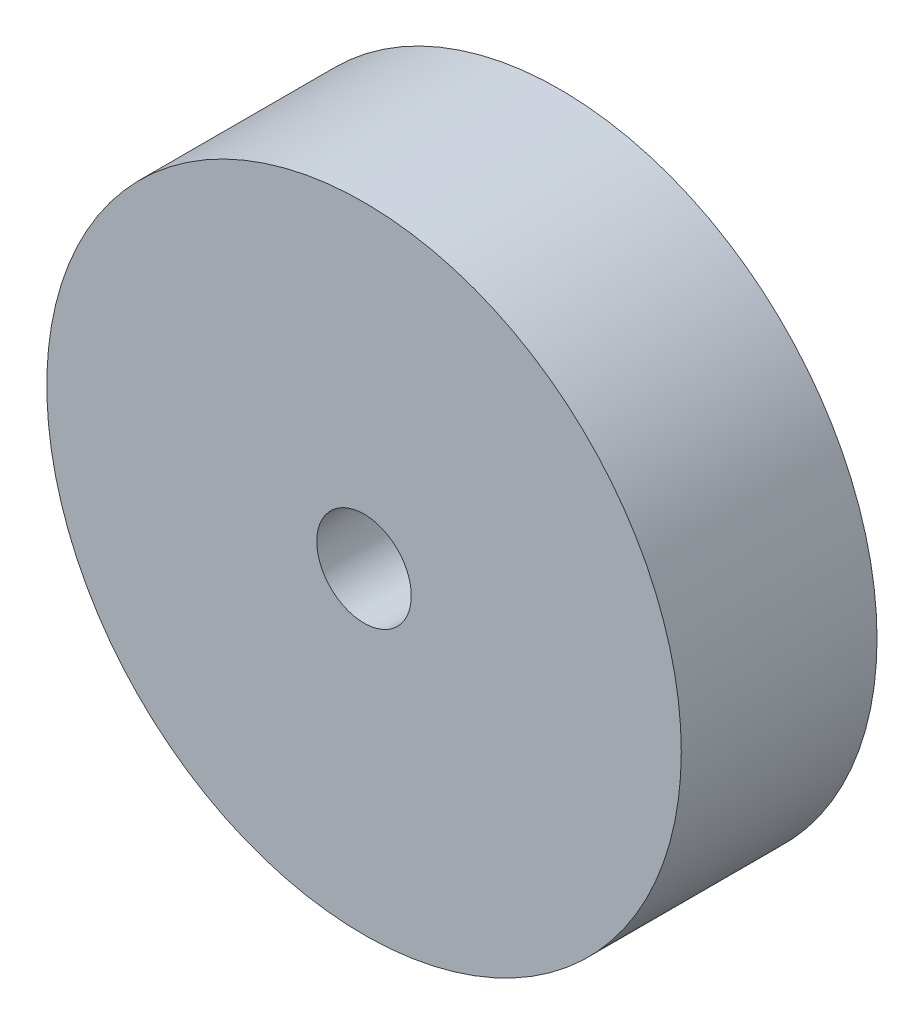
ISO-10303-21;
HEADER;
FILE_DESCRIPTION(('STEP AP214'),'2;1');
FILE_NAME('part.step','',(''),(''),'','','');
FILE_SCHEMA(('AUTOMOTIVE_DESIGN { 1 0 10303 214 1 1 1 1 }'));
ENDSEC;
DATA;
#1=APPLICATION_CONTEXT('core data for automotive mechanical design processes');
#2=APPLICATION_PROTOCOL_DEFINITION('international standard','automotive_design',2000,#1);
#3=PRODUCT_CONTEXT('',#1,'mechanical');
#4=PRODUCT('Part','Part','',(#3));
#5=PRODUCT_RELATED_PRODUCT_CATEGORY('part','',(#4));
#6=PRODUCT_DEFINITION_FORMATION('','',#4);
#7=PRODUCT_DEFINITION_CONTEXT('part definition',#1,'design');
#8=PRODUCT_DEFINITION('design','',#6,#7);
#9=PRODUCT_DEFINITION_SHAPE('','',#8);
#10=(LENGTH_UNIT() NAMED_UNIT(*) SI_UNIT(.MILLI.,.METRE.));
#11=(NAMED_UNIT(*) PLANE_ANGLE_UNIT() SI_UNIT($,.RADIAN.));
#12=(NAMED_UNIT(*) SI_UNIT($,.STERADIAN.) SOLID_ANGLE_UNIT());
#13=UNCERTAINTY_MEASURE_WITH_UNIT(LENGTH_MEASURE(1.E-05),#10,'distance_accuracy_value','');
#14=(GEOMETRIC_REPRESENTATION_CONTEXT(3) GLOBAL_UNCERTAINTY_ASSIGNED_CONTEXT((#13)) GLOBAL_UNIT_ASSIGNED_CONTEXT((#10,
#11,#12)) REPRESENTATION_CONTEXT('',''));
#15=CARTESIAN_POINT('',(0.,0.,0.));
#16=DIRECTION('',(0.,0.,1.));
#17=DIRECTION('',(1.,0.,0.));
#18=AXIS2_PLACEMENT_3D('',#15,#16,#17);
#19=CARTESIAN_POINT('',(-29.0822504710818,-1.70382614903984,5.8));
#20=DIRECTION('',(0.,0.,-1.));
#21=DIRECTION('',(-1.,0.,0.));
#22=AXIS2_PLACEMENT_3D('',#19,#20,#21);
#23=CYLINDRICAL_SURFACE('',#22,9.4);
#24=CARTESIAN_POINT('',(-29.0822504710818,-1.70382614903984,5.8));
#25=DIRECTION('',(0.,0.,1.));
#26=DIRECTION('',(1.,0.,0.));
#27=AXIS2_PLACEMENT_3D('',#24,#25,#26);
#28=CIRCLE('',#27,9.4);
#29=CARTESIAN_POINT('',(-19.6822504710818,-1.70382614903984,5.8));
#30=VERTEX_POINT('',#29);
#31=EDGE_CURVE('E45',#30,#30,#28,.T.);
#32=ORIENTED_EDGE('',*,*,#31,.F.);
#33=EDGE_LOOP('',(#32));
#34=FACE_BOUND('',#33,.T.);
#35=CARTESIAN_POINT('',(-29.0822504710818,-1.70382614903984,0.));
#36=DIRECTION('',(0.,0.,1.));
#37=DIRECTION('',(1.,0.,0.));
#38=AXIS2_PLACEMENT_3D('',#35,#36,#37);
#39=CIRCLE('',#38,9.4);
#40=CARTESIAN_POINT('',(-19.6822504710818,-1.70382614903984,0.));
#41=VERTEX_POINT('',#40);
#42=EDGE_CURVE('E49',#41,#41,#39,.T.);
#43=ORIENTED_EDGE('',*,*,#42,.T.);
#44=EDGE_LOOP('',(#43));
#45=FACE_BOUND('',#44,.T.);
#46=ADVANCED_FACE('F34',(#34,#45),#23,.T.);
#47=CARTESIAN_POINT('',(-29.0822504710818,-1.70382614903984,5.8));
#48=DIRECTION('',(0.,0.,1.));
#49=DIRECTION('',(1.,0.,0.));
#50=AXIS2_PLACEMENT_3D('',#47,#48,#49);
#51=PLANE('',#50);
#52=CARTESIAN_POINT('',(-29.0822504710818,-1.70382614903984,5.8));
#53=DIRECTION('',(0.,0.,-1.));
#54=DIRECTION('',(-1.,0.,0.));
#55=AXIS2_PLACEMENT_3D('',#52,#53,#54);
#56=CIRCLE('',#55,1.4);
#57=CARTESIAN_POINT('',(-30.4822504710818,-1.70382614903984,5.8));
#58=VERTEX_POINT('',#57);
#59=EDGE_CURVE('E58',#58,#58,#56,.T.);
#60=ORIENTED_EDGE('',*,*,#59,.T.);
#61=EDGE_LOOP('',(#60));
#62=FACE_BOUND('',#61,.T.);
#63=ORIENTED_EDGE('',*,*,#31,.T.);
#64=EDGE_LOOP('',(#63));
#65=FACE_BOUND('',#64,.T.);
#66=ADVANCED_FACE('F67',(#62,#65),#51,.T.);
#67=CARTESIAN_POINT('',(-29.0822504710818,-1.70382614903984,0.));
#68=DIRECTION('',(0.,0.,1.));
#69=DIRECTION('',(1.,0.,0.));
#70=AXIS2_PLACEMENT_3D('',#67,#68,#69);
#71=PLANE('',#70);
#72=CARTESIAN_POINT('',(-29.0822504710818,-1.70382614903984,0.));
#73=DIRECTION('',(0.,0.,-1.));
#74=DIRECTION('',(-1.,0.,0.));
#75=AXIS2_PLACEMENT_3D('',#72,#73,#74);
#76=CIRCLE('',#75,7.95);
#77=CARTESIAN_POINT('',(-37.0322504710818,-1.70382614903984,0.));
#78=VERTEX_POINT('',#77);
#79=EDGE_CURVE('E55',#78,#78,#76,.T.);
#80=ORIENTED_EDGE('',*,*,#79,.F.);
#81=EDGE_LOOP('',(#80));
#82=FACE_BOUND('',#81,.T.);
#83=ORIENTED_EDGE('',*,*,#42,.F.);
#84=EDGE_LOOP('',(#83));
#85=FACE_BOUND('',#84,.T.);
#86=ADVANCED_FACE('F90',(#82,#85),#71,.F.);
#87=CARTESIAN_POINT('',(-29.0822504710818,-1.70382614903984,3.2));
#88=DIRECTION('',(0.,0.,-1.));
#89=DIRECTION('',(-1.,0.,0.));
#90=AXIS2_PLACEMENT_3D('',#87,#88,#89);
#91=CYLINDRICAL_SURFACE('',#90,7.95);
#92=CARTESIAN_POINT('',(-29.0822504710818,-1.70382614903984,3.2));
#93=DIRECTION('',(0.,0.,-1.));
#94=DIRECTION('',(-1.,0.,0.));
#95=AXIS2_PLACEMENT_3D('',#92,#93,#94);
#96=CIRCLE('',#95,7.95);
#97=CARTESIAN_POINT('',(-37.0322504710818,-1.70382614903984,3.2));
#98=VERTEX_POINT('',#97);
#99=EDGE_CURVE('E53',#98,#98,#96,.T.);
#100=ORIENTED_EDGE('',*,*,#99,.F.);
#101=EDGE_LOOP('',(#100));
#102=FACE_BOUND('',#101,.T.);
#103=ORIENTED_EDGE('',*,*,#79,.T.);
#104=EDGE_LOOP('',(#103));
#105=FACE_BOUND('',#104,.T.);
#106=ADVANCED_FACE('F83',(#102,#105),#91,.F.);
#107=CARTESIAN_POINT('',(-29.0822504710818,-1.70382614903984,3.2));
#108=DIRECTION('',(0.,0.,-1.));
#109=DIRECTION('',(-1.,0.,0.));
#110=AXIS2_PLACEMENT_3D('',#107,#108,#109);
#111=PLANE('',#110);
#112=CARTESIAN_POINT('',(-29.0822504710818,-1.70382614903984,3.2));
#113=DIRECTION('',(0.,0.,-1.));
#114=DIRECTION('',(-1.,0.,0.));
#115=AXIS2_PLACEMENT_3D('',#112,#113,#114);
#116=CIRCLE('',#115,3.60220524199566);
#117=CARTESIAN_POINT('',(-32.6844557130775,-1.70382614903984,3.2));
#118=VERTEX_POINT('',#117);
#119=EDGE_CURVE('E10',#118,#118,#116,.F.);
#120=ORIENTED_EDGE('',*,*,#119,.T.);
#121=EDGE_LOOP('',(#120));
#122=FACE_BOUND('',#121,.T.);
#123=ORIENTED_EDGE('',*,*,#99,.T.);
#124=EDGE_LOOP('',(#123));
#125=FACE_BOUND('',#124,.T.);
#126=ADVANCED_FACE('F78',(#122,#125),#111,.T.);
#127=CARTESIAN_POINT('',(-29.0822504710818,-1.70382614903984,1.6125));
#128=DIRECTION('',(0.,0.,-1.));
#129=DIRECTION('',(-1.,0.,0.));
#130=AXIS2_PLACEMENT_3D('',#127,#128,#129);
#131=PLANE('',#130);
#132=CARTESIAN_POINT('',(-29.0822504710818,-1.70382614903984,1.6125));
#133=DIRECTION('',(0.,0.,-1.));
#134=DIRECTION('',(-1.,0.,0.));
#135=AXIS2_PLACEMENT_3D('',#132,#133,#134);
#136=CIRCLE('',#135,2.22221254571239);
#137=CARTESIAN_POINT('',(-31.3044630167942,-1.70382614903984,1.6125));
#138=VERTEX_POINT('',#137);
#139=EDGE_CURVE('E41',#138,#138,#136,.T.);
#140=ORIENTED_EDGE('',*,*,#139,.T.);
#141=EDGE_LOOP('',(#140));
#142=FACE_BOUND('',#141,.T.);
#143=CARTESIAN_POINT('',(-29.0822504710818,-1.70382614903984,1.6125));
#144=DIRECTION('',(0.,0.,-1.));
#145=DIRECTION('',(-1.,0.,0.));
#146=AXIS2_PLACEMENT_3D('',#143,#144,#145);
#147=CIRCLE('',#146,1.4);
#148=CARTESIAN_POINT('',(-30.4822504710818,-1.70382614903984,1.6125));
#149=VERTEX_POINT('',#148);
#150=EDGE_CURVE('E61',#149,#149,#147,.T.);
#151=ORIENTED_EDGE('',*,*,#150,.F.);
#152=EDGE_LOOP('',(#151));
#153=FACE_BOUND('',#152,.T.);
#154=ADVANCED_FACE('F73',(#142,#153),#131,.T.);
#155=CARTESIAN_POINT('',(-29.0822504710818,-1.70382614903984,5.8));
#156=DIRECTION('',(0.,0.,-1.));
#157=DIRECTION('',(-1.,0.,0.));
#158=AXIS2_PLACEMENT_3D('',#155,#156,#157);
#159=CYLINDRICAL_SURFACE('',#158,1.4);
#160=ORIENTED_EDGE('',*,*,#59,.F.);
#161=EDGE_LOOP('',(#160));
#162=FACE_BOUND('',#161,.T.);
#163=ORIENTED_EDGE('',*,*,#150,.T.);
#164=EDGE_LOOP('',(#163));
#165=FACE_BOUND('',#164,.T.);
#166=ADVANCED_FACE('F70',(#162,#165),#159,.F.);
#167=CARTESIAN_POINT('',(-29.0822504710818,-1.70382614903984,1.6125));
#168=DIRECTION('',(0.,0.,1.));
#169=DIRECTION('',(1.,0.,0.));
#170=AXIS2_PLACEMENT_3D('',#167,#168,#169);
#171=CONICAL_SURFACE('',#170,2.22221254571239,0.71558499331768);
#172=ORIENTED_EDGE('',*,*,#119,.F.);
#173=EDGE_LOOP('',(#172));
#174=FACE_BOUND('',#173,.T.);
#175=ORIENTED_EDGE('',*,*,#139,.F.);
#176=EDGE_LOOP('',(#175));
#177=FACE_BOUND('',#176,.T.);
#178=ADVANCED_FACE('F36',(#174,#177),#171,.T.);
#179=CLOSED_SHELL('',(#46,#66,#86,#106,#126,#154,#166,#178));
#180=MANIFOLD_SOLID_BREP('B2',#179);
#181=ADVANCED_BREP_SHAPE_REPRESENTATION('',(#18,#180),#14);
#182=SHAPE_DEFINITION_REPRESENTATION(#9,#181);
ENDSEC;
END-ISO-10303-21;
